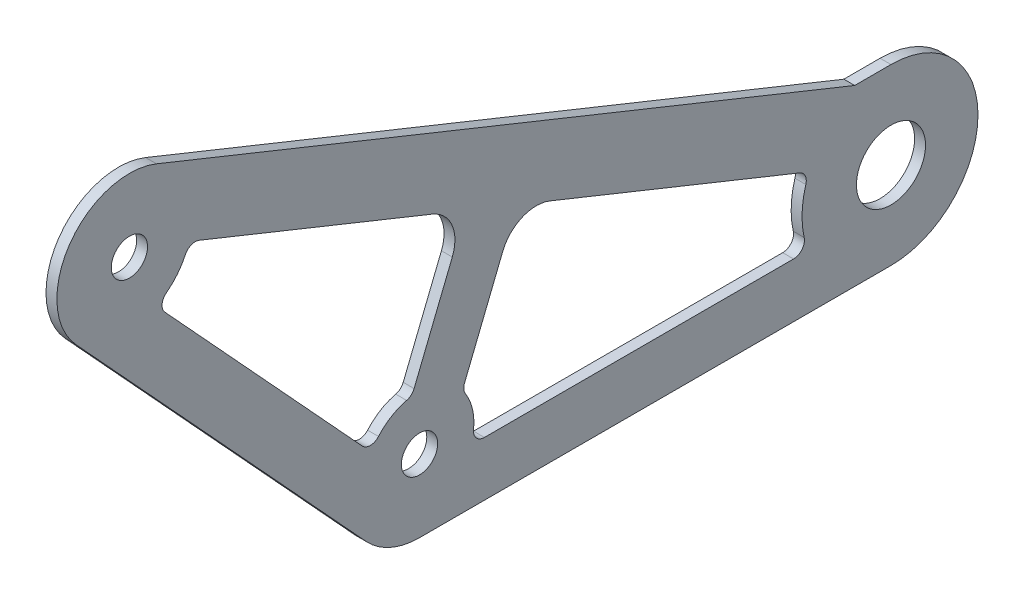
ISO-10303-21;
HEADER;
FILE_DESCRIPTION(('STEP AP214'),'2;1');
FILE_NAME('part.step','',(''),(''),'','','');
FILE_SCHEMA(('AUTOMOTIVE_DESIGN { 1 0 10303 214 1 1 1 1 }'));
ENDSEC;
DATA;
#1=APPLICATION_CONTEXT('core data for automotive mechanical design processes');
#2=APPLICATION_PROTOCOL_DEFINITION('international standard','automotive_design',2000,#1);
#3=PRODUCT_CONTEXT('',#1,'mechanical');
#4=PRODUCT('Part','Part','',(#3));
#5=PRODUCT_RELATED_PRODUCT_CATEGORY('part','',(#4));
#6=PRODUCT_DEFINITION_FORMATION('','',#4);
#7=PRODUCT_DEFINITION_CONTEXT('part definition',#1,'design');
#8=PRODUCT_DEFINITION('design','',#6,#7);
#9=PRODUCT_DEFINITION_SHAPE('','',#8);
#10=(LENGTH_UNIT() NAMED_UNIT(*) SI_UNIT(.MILLI.,.METRE.));
#11=(NAMED_UNIT(*) PLANE_ANGLE_UNIT() SI_UNIT($,.RADIAN.));
#12=(NAMED_UNIT(*) SI_UNIT($,.STERADIAN.) SOLID_ANGLE_UNIT());
#13=UNCERTAINTY_MEASURE_WITH_UNIT(LENGTH_MEASURE(1.E-05),#10,'distance_accuracy_value','');
#14=(GEOMETRIC_REPRESENTATION_CONTEXT(3) GLOBAL_UNCERTAINTY_ASSIGNED_CONTEXT((#13)) GLOBAL_UNIT_ASSIGNED_CONTEXT((#10,
#11,#12)) REPRESENTATION_CONTEXT('',''));
#15=CARTESIAN_POINT('',(0.,0.,0.));
#16=DIRECTION('',(0.,0.,1.));
#17=DIRECTION('',(1.,0.,0.));
#18=AXIS2_PLACEMENT_3D('',#15,#16,#17);
#19=CARTESIAN_POINT('',(3.,20.,65.));
#20=DIRECTION('',(1.,0.,0.));
#21=DIRECTION('',(0.,0.,-1.));
#22=AXIS2_PLACEMENT_3D('',#19,#20,#21);
#23=PLANE('',#22);
#24=CARTESIAN_POINT('',(3.,18.,-38.1369096156083));
#25=DIRECTION('',(1.,0.,0.));
#26=DIRECTION('',(0.,0.,-1.));
#27=AXIS2_PLACEMENT_3D('',#24,#25,#26);
#28=CIRCLE('',#27,3.);
#29=CARTESIAN_POINT('',(3.,15.,-38.1369096156083));
#30=VERTEX_POINT('',#29);
#31=CARTESIAN_POINT('',(3.,18.6539509536785,-41.0647668782123));
#32=VERTEX_POINT('',#31);
#33=EDGE_CURVE('E64',#30,#32,#28,.T.);
#34=ORIENTED_EDGE('',*,*,#33,.F.);
#35=DIRECTION('',(0.,0.,-1.));
#36=VECTOR('',#35,1.);
#37=CARTESIAN_POINT('',(3.,15.,-38.1369096156083));
#38=LINE('',#37,#36);
#39=CARTESIAN_POINT('',(3.,15.,47.1114561800018));
#40=VERTEX_POINT('',#39);
#41=EDGE_CURVE('E296',#40,#30,#38,.T.);
#42=ORIENTED_EDGE('',*,*,#41,.F.);
#43=CARTESIAN_POINT('',(3.,18.,47.1114561800018));
#44=DIRECTION('',(1.,0.,0.));
#45=DIRECTION('',(0.,0.,1.));
#46=AXIS2_PLACEMENT_3D('',#43,#44,#45);
#47=CIRCLE('',#46,3.);
#48=CARTESIAN_POINT('',(3.,18.3333333333333,50.0928801500015));
#49=VERTEX_POINT('',#48);
#50=EDGE_CURVE('E316',#49,#40,#47,.T.);
#51=ORIENTED_EDGE('',*,*,#50,.F.);
#52=CARTESIAN_POINT('',(3.,19.9999999999999,65.0000000000001));
#53=DIRECTION('',(-1.,0.,0.));
#54=DIRECTION('',(0.,0.,-1.));
#55=AXIS2_PLACEMENT_3D('',#52,#53,#54);
#56=CIRCLE('',#55,15.);
#57=CARTESIAN_POINT('',(3.,28.0318087509721,52.3315333134667));
#58=VERTEX_POINT('',#57);
#59=EDGE_CURVE('E319',#58,#49,#56,.T.);
#60=ORIENTED_EDGE('',*,*,#59,.F.);
#61=CARTESIAN_POINT('',(3.,29.6381705011666,49.7978399761601));
#62=DIRECTION('',(1.,0.,0.));
#63=DIRECTION('',(0.,0.,-1.));
#64=AXIS2_PLACEMENT_3D('',#61,#62,#63);
#65=CIRCLE('',#64,3.);
#66=CARTESIAN_POINT('',(3.,30.7590751378482,52.5805675581317));
#67=VERTEX_POINT('',#66);
#68=EDGE_CURVE('E322',#67,#58,#65,.T.);
#69=ORIENTED_EDGE('',*,*,#68,.F.);
#70=DIRECTION('',(0.,-0.927575860657207,0.373634878893876));
#71=VECTOR('',#70,1.);
#72=CARTESIAN_POINT('',(3.,30.7590751378482,52.5805675581317));
#73=LINE('',#72,#71);
#74=CARTESIAN_POINT('',(3.,56.9056929969496,42.0485034848514));
#75=VERTEX_POINT('',#74);
#76=EDGE_CURVE('E325',#75,#67,#73,.T.);
#77=ORIENTED_EDGE('',*,*,#76,.F.);
#78=CARTESIAN_POINT('',(3.,53.1693442080108,32.7727448782793));
#79=DIRECTION('',(1.,0.,0.));
#80=DIRECTION('',(0.,0.,-1.));
#81=AXIS2_PLACEMENT_3D('',#78,#79,#80);
#82=CIRCLE('',#81,10.);
#83=CARTESIAN_POINT('',(3.,62.4451028145829,29.0363960893406));
#84=VERTEX_POINT('',#83);
#85=EDGE_CURVE('E328',#84,#75,#82,.T.);
#86=ORIENTED_EDGE('',*,*,#85,.F.);
#87=DIRECTION('',(0.,0.373634878893876,0.927575860657207));
#88=VECTOR('',#87,1.);
#89=CARTESIAN_POINT('',(3.,34.7300708087196,-39.7681939480967));
#90=LINE('',#89,#88);
#91=CARTESIAN_POINT('',(3.,34.7300708087196,-39.7681939480967));
#92=VERTEX_POINT('',#91);
#93=EDGE_CURVE('E331',#92,#84,#90,.T.);
#94=ORIENTED_EDGE('',*,*,#93,.F.);
#95=CARTESIAN_POINT('',(3.,31.947343226748,-38.647289311415));
#96=DIRECTION('',(1.,0.,0.));
#97=DIRECTION('',(0.,0.,1.));
#98=AXIS2_PLACEMENT_3D('',#95,#96,#97);
#99=CIRCLE('',#98,2.99999999999999);
#100=CARTESIAN_POINT('',(3.,31.081147779691,-41.5195193592172));
#101=VERTEX_POINT('',#100);
#102=EDGE_CURVE('E334',#101,#92,#99,.T.);
#103=ORIENTED_EDGE('',*,*,#102,.F.);
#104=CARTESIAN_POINT('',(3.,24.,-65.));
#105=DIRECTION('',(-1.,0.,0.));
#106=DIRECTION('',(0.,0.,-1.));
#107=AXIS2_PLACEMENT_3D('',#104,#105,#106);
#108=CIRCLE('',#107,24.525);
#109=EDGE_CURVE('E337',#32,#101,#108,.T.);
#110=ORIENTED_EDGE('',*,*,#109,.F.);
#111=EDGE_LOOP('',(#34,#42,#51,#60,#69,#77,#86,#94,#103,#110));
#112=FACE_BOUND('',#111,.T.);
#113=CARTESIAN_POINT('',(3.,20.,65.));
#114=DIRECTION('',(1.,0.,0.));
#115=DIRECTION('',(0.,0.,-1.));
#116=AXIS2_PLACEMENT_3D('',#113,#114,#115);
#117=CIRCLE('',#116,4.99999999999999);
#118=CARTESIAN_POINT('',(3.,20.,60.));
#119=VERTEX_POINT('',#118);
#120=EDGE_CURVE('E236',#119,#119,#117,.T.);
#121=ORIENTED_EDGE('',*,*,#120,.F.);
#122=EDGE_LOOP('',(#121));
#123=FACE_BOUND('',#122,.T.);
#124=CARTESIAN_POINT('',(3.,107.,145.));
#125=DIRECTION('',(1.,0.,0.));
#126=DIRECTION('',(0.,0.,-1.));
#127=AXIS2_PLACEMENT_3D('',#124,#125,#126);
#128=CIRCLE('',#127,5.);
#129=CARTESIAN_POINT('',(3.,107.,140.));
#130=VERTEX_POINT('',#129);
#131=EDGE_CURVE('E373',#130,#130,#128,.T.);
#132=ORIENTED_EDGE('',*,*,#131,.F.);
#133=EDGE_LOOP('',(#132));
#134=FACE_BOUND('',#133,.T.);
#135=CARTESIAN_POINT('',(3.,24.,-65.));
#136=DIRECTION('',(1.,0.,0.));
#137=DIRECTION('',(0.,0.,-1.));
#138=AXIS2_PLACEMENT_3D('',#135,#136,#137);
#139=CIRCLE('',#138,9.52499999999998);
#140=CARTESIAN_POINT('',(3.,24.,-74.525));
#141=VERTEX_POINT('',#140);
#142=EDGE_CURVE('E379',#141,#141,#139,.T.);
#143=ORIENTED_EDGE('',*,*,#142,.F.);
#144=EDGE_LOOP('',(#143));
#145=FACE_BOUND('',#144,.T.);
#146=CARTESIAN_POINT('',(3.,20.,65.));
#147=DIRECTION('',(1.,0.,0.));
#148=DIRECTION('',(0.,0.,-1.));
#149=AXIS2_PLACEMENT_3D('',#146,#147,#148);
#150=CIRCLE('',#149,20.);
#151=CARTESIAN_POINT('',(3.,6.46253571137716,79.7219924138773));
#152=VERTEX_POINT('',#151);
#153=CARTESIAN_POINT('',(3.,0.,65.));
#154=VERTEX_POINT('',#153);
#155=EDGE_CURVE('E386',#152,#154,#150,.T.);
#156=ORIENTED_EDGE('',*,*,#155,.T.);
#157=DIRECTION('',(0.,0.,-1.));
#158=VECTOR('',#157,1.);
#159=CARTESIAN_POINT('',(3.,0.,65.));
#160=LINE('',#159,#158);
#161=CARTESIAN_POINT('',(3.,0.,-65.));
#162=VERTEX_POINT('',#161);
#163=EDGE_CURVE('E389',#154,#162,#160,.T.);
#164=ORIENTED_EDGE('',*,*,#163,.T.);
#165=CARTESIAN_POINT('',(3.,24.,-65.));
#166=DIRECTION('',(1.,0.,0.));
#167=DIRECTION('',(0.,0.,-1.));
#168=AXIS2_PLACEMENT_3D('',#165,#166,#167);
#169=CIRCLE('',#168,24.);
#170=CARTESIAN_POINT('',(3.,48.,-65.));
#171=VERTEX_POINT('',#170);
#172=EDGE_CURVE('E392',#162,#171,#169,.T.);
#173=ORIENTED_EDGE('',*,*,#172,.T.);
#174=DIRECTION('',(0.,0.,1.));
#175=VECTOR('',#174,1.);
#176=CARTESIAN_POINT('',(3.,48.,-65.));
#177=LINE('',#176,#175);
#178=CARTESIAN_POINT('',(3.,48.,-55.));
#179=VERTEX_POINT('',#178);
#180=EDGE_CURVE('E394',#171,#179,#177,.T.);
#181=ORIENTED_EDGE('',*,*,#180,.T.);
#182=DIRECTION('',(0.,0.373634878893876,0.927575860657207));
#183=VECTOR('',#182,1.);
#184=CARTESIAN_POINT('',(3.,125.551517213144,137.527302422122));
#185=LINE('',#184,#183);
#186=CARTESIAN_POINT('',(3.,125.551517213144,137.527302422122));
#187=VERTEX_POINT('',#186);
#188=EDGE_CURVE('E396',#179,#187,#185,.T.);
#189=ORIENTED_EDGE('',*,*,#188,.T.);
#190=CARTESIAN_POINT('',(3.,107.,145.));
#191=DIRECTION('',(1.,0.,0.));
#192=DIRECTION('',(0.,0.,-1.));
#193=AXIS2_PLACEMENT_3D('',#190,#191,#192);
#194=CIRCLE('',#193,20.);
#195=CARTESIAN_POINT('',(3.,93.4625357113772,159.721992413877));
#196=VERTEX_POINT('',#195);
#197=EDGE_CURVE('E398',#187,#196,#194,.T.);
#198=ORIENTED_EDGE('',*,*,#197,.T.);
#199=DIRECTION('',(0.,-0.736099620693866,-0.676873214431142));
#200=VECTOR('',#199,1.);
#201=CARTESIAN_POINT('',(3.,93.4625357113771,159.721992413877));
#202=LINE('',#201,#200);
#203=EDGE_CURVE('E400',#196,#152,#202,.T.);
#204=ORIENTED_EDGE('',*,*,#203,.T.);
#205=EDGE_LOOP('',(#156,#164,#173,#181,#189,#198,#204));
#206=FACE_BOUND('',#205,.T.);
#207=CARTESIAN_POINT('',(3.,90.9980560701508,133.002592343929));
#208=DIRECTION('',(1.,0.,0.));
#209=DIRECTION('',(0.,0.,1.));
#210=AXIS2_PLACEMENT_3D('',#207,#208,#209);
#211=CIRCLE('',#210,2.99999999999999);
#212=CARTESIAN_POINT('',(3.,93.3983476596282,134.802203492339));
#213=VERTEX_POINT('',#212);
#214=CARTESIAN_POINT('',(3.,88.9674364268574,135.21089120601));
#215=VERTEX_POINT('',#214);
#216=EDGE_CURVE('E56',#213,#215,#211,.T.);
#217=ORIENTED_EDGE('',*,*,#216,.F.);
#218=CARTESIAN_POINT('',(3.,107.,145.));
#219=DIRECTION('',(-1.,0.,0.));
#220=DIRECTION('',(0.,0.,-1.));
#221=AXIS2_PLACEMENT_3D('',#218,#219,#220);
#222=CIRCLE('',#221,17.);
#223=CARTESIAN_POINT('',(3.,99.8677122869729,129.568523337716));
#224=VERTEX_POINT('',#223);
#225=EDGE_CURVE('E228',#224,#213,#222,.T.);
#226=ORIENTED_EDGE('',*,*,#225,.F.);
#227=CARTESIAN_POINT('',(3.,98.6090732787916,126.845321573784));
#228=DIRECTION('',(1.,0.,0.));
#229=DIRECTION('',(0.,0.,-1.));
#230=AXIS2_PLACEMENT_3D('',#227,#228,#229);
#231=CIRCLE('',#230,3.);
#232=CARTESIAN_POINT('',(3.,101.391800860763,125.724416937102));
#233=VERTEX_POINT('',#232);
#234=EDGE_CURVE('E269',#233,#224,#231,.T.);
#235=ORIENTED_EDGE('',*,*,#234,.F.);
#236=DIRECTION('',(0.,0.373634878893876,0.927575860657207));
#237=VECTOR('',#236,1.);
#238=CARTESIAN_POINT('',(3.,101.391800860763,125.724416937102));
#239=LINE('',#238,#237);
#240=CARTESIAN_POINT('',(3.,75.5223235758686,61.5015512123428));
#241=VERTEX_POINT('',#240);
#242=EDGE_CURVE('E266',#241,#233,#239,.T.);
#243=ORIENTED_EDGE('',*,*,#242,.F.);
#244=CARTESIAN_POINT('',(3.,66.2465649692965,65.2379000012816));
#245=DIRECTION('',(1.,0.,0.));
#246=DIRECTION('',(0.,0.,1.));
#247=AXIS2_PLACEMENT_3D('',#244,#245,#246);
#248=CIRCLE('',#247,9.99999999999999);
#249=CARTESIAN_POINT('',(3.,62.5102161803577,55.9621413947095));
#250=VERTEX_POINT('',#249);
#251=EDGE_CURVE('E263',#250,#241,#248,.T.);
#252=ORIENTED_EDGE('',*,*,#251,.F.);
#253=DIRECTION('',(0.,0.927575860657208,-0.373634878893875));
#254=VECTOR('',#253,1.);
#255=CARTESIAN_POINT('',(3.,36.3635983212564,66.4942054679898));
#256=LINE('',#255,#254);
#257=CARTESIAN_POINT('',(3.,36.3635983212564,66.4942054679898));
#258=VERTEX_POINT('',#257);
#259=EDGE_CURVE('E260',#258,#250,#256,.T.);
#260=ORIENTED_EDGE('',*,*,#259,.F.);
#261=CARTESIAN_POINT('',(3.,37.4845029579381,69.2769330499614));
#262=DIRECTION('',(1.,0.,0.));
#263=DIRECTION('',(0.,0.,1.));
#264=AXIS2_PLACEMENT_3D('',#261,#262,#263);
#265=CIRCLE('',#264,3.);
#266=CARTESIAN_POINT('',(3.,34.570419131615,68.5641108749678));
#267=VERTEX_POINT('',#266);
#268=EDGE_CURVE('E257',#267,#258,#265,.T.);
#269=ORIENTED_EDGE('',*,*,#268,.F.);
#270=CARTESIAN_POINT('',(3.,19.9999999999999,65.0000000000001));
#271=DIRECTION('',(-1.,0.,0.));
#272=DIRECTION('',(0.,0.,-1.));
#273=AXIS2_PLACEMENT_3D('',#270,#271,#272);
#274=CIRCLE('',#273,15.);
#275=CARTESIAN_POINT('',(3.,29.84500324317,76.3170628319353));
#276=VERTEX_POINT('',#275);
#277=EDGE_CURVE('E254',#276,#267,#274,.T.);
#278=ORIENTED_EDGE('',*,*,#277,.F.);
#279=CARTESIAN_POINT('',(3.,31.8140038918041,78.5804753983223));
#280=DIRECTION('',(1.,0.,0.));
#281=DIRECTION('',(0.,0.,-1.));
#282=AXIS2_PLACEMENT_3D('',#279,#280,#281);
#283=CIRCLE('',#282,3.);
#284=CARTESIAN_POINT('',(3.,29.7833842485106,80.7887742604039));
#285=VERTEX_POINT('',#284);
#286=EDGE_CURVE('E251',#285,#276,#283,.T.);
#287=ORIENTED_EDGE('',*,*,#286,.F.);
#288=DIRECTION('',(0.,-0.736099620693866,-0.676873214431141));
#289=VECTOR('',#288,1.);
#290=CARTESIAN_POINT('',(3.,88.9674364268574,135.21089120601));
#291=LINE('',#290,#289);
#292=EDGE_CURVE('E244',#215,#285,#291,.T.);
#293=ORIENTED_EDGE('',*,*,#292,.F.);
#294=EDGE_LOOP('',(#217,#226,#235,#243,#252,#260,#269,#278,#287,#293));
#295=FACE_BOUND('',#294,.T.);
#296=ADVANCED_FACE('F41',(#112,#123,#134,#145,#206,#295),#23,.T.);
#297=CARTESIAN_POINT('',(0.,20.,65.));
#298=DIRECTION('',(1.,0.,0.));
#299=DIRECTION('',(0.,0.,-1.));
#300=AXIS2_PLACEMENT_3D('',#297,#298,#299);
#301=PLANE('',#300);
#302=CARTESIAN_POINT('',(0.,20.,65.));
#303=DIRECTION('',(1.,0.,0.));
#304=DIRECTION('',(0.,0.,-1.));
#305=AXIS2_PLACEMENT_3D('',#302,#303,#304);
#306=CIRCLE('',#305,4.99999999999999);
#307=CARTESIAN_POINT('',(0.,20.,60.));
#308=VERTEX_POINT('',#307);
#309=EDGE_CURVE('E370',#308,#308,#306,.T.);
#310=ORIENTED_EDGE('',*,*,#309,.T.);
#311=EDGE_LOOP('',(#310));
#312=FACE_BOUND('',#311,.T.);
#313=CARTESIAN_POINT('',(0.,107.,145.));
#314=DIRECTION('',(1.,0.,0.));
#315=DIRECTION('',(0.,0.,-1.));
#316=AXIS2_PLACEMENT_3D('',#313,#314,#315);
#317=CIRCLE('',#316,5.);
#318=CARTESIAN_POINT('',(0.,107.,140.));
#319=VERTEX_POINT('',#318);
#320=EDGE_CURVE('E376',#319,#319,#317,.T.);
#321=ORIENTED_EDGE('',*,*,#320,.T.);
#322=EDGE_LOOP('',(#321));
#323=FACE_BOUND('',#322,.T.);
#324=CARTESIAN_POINT('',(0.,24.,-65.));
#325=DIRECTION('',(1.,0.,0.));
#326=DIRECTION('',(0.,0.,-1.));
#327=AXIS2_PLACEMENT_3D('',#324,#325,#326);
#328=CIRCLE('',#327,9.52499999999999);
#329=CARTESIAN_POINT('',(0.,24.,-74.525));
#330=VERTEX_POINT('',#329);
#331=EDGE_CURVE('E382',#330,#330,#328,.T.);
#332=ORIENTED_EDGE('',*,*,#331,.T.);
#333=EDGE_LOOP('',(#332));
#334=FACE_BOUND('',#333,.T.);
#335=CARTESIAN_POINT('',(0.,20.,65.));
#336=DIRECTION('',(1.,0.,0.));
#337=DIRECTION('',(0.,0.,-1.));
#338=AXIS2_PLACEMENT_3D('',#335,#336,#337);
#339=CIRCLE('',#338,20.);
#340=CARTESIAN_POINT('',(0.,6.46253571137716,79.7219924138773));
#341=VERTEX_POINT('',#340);
#342=CARTESIAN_POINT('',(0.,0.,65.));
#343=VERTEX_POINT('',#342);
#344=EDGE_CURVE('E385',#341,#343,#339,.T.);
#345=ORIENTED_EDGE('',*,*,#344,.F.);
#346=DIRECTION('',(0.,-0.736099620693866,-0.676873214431142));
#347=VECTOR('',#346,1.);
#348=CARTESIAN_POINT('',(0.,93.4625357113771,159.721992413877));
#349=LINE('',#348,#347);
#350=CARTESIAN_POINT('',(0.,93.4625357113772,159.721992413877));
#351=VERTEX_POINT('',#350);
#352=EDGE_CURVE('E390',#351,#341,#349,.T.);
#353=ORIENTED_EDGE('',*,*,#352,.F.);
#354=CARTESIAN_POINT('',(0.,107.,145.));
#355=DIRECTION('',(1.,0.,0.));
#356=DIRECTION('',(0.,0.,-1.));
#357=AXIS2_PLACEMENT_3D('',#354,#355,#356);
#358=CIRCLE('',#357,20.);
#359=CARTESIAN_POINT('',(0.,125.551517213144,137.527302422122));
#360=VERTEX_POINT('',#359);
#361=EDGE_CURVE('E413',#360,#351,#358,.T.);
#362=ORIENTED_EDGE('',*,*,#361,.F.);
#363=DIRECTION('',(0.,0.373634878893876,0.927575860657207));
#364=VECTOR('',#363,1.);
#365=CARTESIAN_POINT('',(0.,125.551517213144,137.527302422122));
#366=LINE('',#365,#364);
#367=CARTESIAN_POINT('',(0.,48.,-55.));
#368=VERTEX_POINT('',#367);
#369=EDGE_CURVE('E411',#368,#360,#366,.T.);
#370=ORIENTED_EDGE('',*,*,#369,.F.);
#371=DIRECTION('',(0.,0.,1.));
#372=VECTOR('',#371,1.);
#373=CARTESIAN_POINT('',(0.,48.,-65.));
#374=LINE('',#373,#372);
#375=CARTESIAN_POINT('',(0.,48.,-65.));
#376=VERTEX_POINT('',#375);
#377=EDGE_CURVE('E409',#376,#368,#374,.T.);
#378=ORIENTED_EDGE('',*,*,#377,.F.);
#379=CARTESIAN_POINT('',(0.,24.,-65.));
#380=DIRECTION('',(1.,0.,0.));
#381=DIRECTION('',(0.,0.,-1.));
#382=AXIS2_PLACEMENT_3D('',#379,#380,#381);
#383=CIRCLE('',#382,24.);
#384=CARTESIAN_POINT('',(0.,0.,-65.));
#385=VERTEX_POINT('',#384);
#386=EDGE_CURVE('E407',#385,#376,#383,.T.);
#387=ORIENTED_EDGE('',*,*,#386,.F.);
#388=DIRECTION('',(0.,0.,-1.));
#389=VECTOR('',#388,1.);
#390=CARTESIAN_POINT('',(0.,0.,65.));
#391=LINE('',#390,#389);
#392=EDGE_CURVE('E405',#343,#385,#391,.T.);
#393=ORIENTED_EDGE('',*,*,#392,.F.);
#394=EDGE_LOOP('',(#345,#353,#362,#370,#378,#387,#393));
#395=FACE_BOUND('',#394,.T.);
#396=DIRECTION('',(0.,0.,1.));
#397=VECTOR('',#396,1.);
#398=CARTESIAN_POINT('',(0.,15.,-38.1369096156083));
#399=LINE('',#398,#397);
#400=CARTESIAN_POINT('',(0.,15.,-38.1369096156083));
#401=VERTEX_POINT('',#400);
#402=CARTESIAN_POINT('',(0.,15.,47.1114561800018));
#403=VERTEX_POINT('',#402);
#404=EDGE_CURVE('E344',#401,#403,#399,.T.);
#405=ORIENTED_EDGE('',*,*,#404,.F.);
#406=CARTESIAN_POINT('',(0.,18.,-38.1369096156083));
#407=DIRECTION('',(1.,0.,0.));
#408=DIRECTION('',(0.,0.,-1.));
#409=AXIS2_PLACEMENT_3D('',#406,#407,#408);
#410=CIRCLE('',#409,3.);
#411=CARTESIAN_POINT('',(0.,18.6539509536785,-41.0647668782123));
#412=VERTEX_POINT('',#411);
#413=EDGE_CURVE('E341',#412,#401,#410,.F.);
#414=ORIENTED_EDGE('',*,*,#413,.F.);
#415=CARTESIAN_POINT('',(0.,24.,-65.));
#416=DIRECTION('',(1.,0.,0.));
#417=DIRECTION('',(0.,0.,-1.));
#418=AXIS2_PLACEMENT_3D('',#415,#416,#417);
#419=CIRCLE('',#418,24.525);
#420=CARTESIAN_POINT('',(0.,31.081147779691,-41.5195193592172));
#421=VERTEX_POINT('',#420);
#422=EDGE_CURVE('E290',#421,#412,#419,.T.);
#423=ORIENTED_EDGE('',*,*,#422,.F.);
#424=CARTESIAN_POINT('',(0.,31.947343226748,-38.647289311415));
#425=DIRECTION('',(1.,0.,0.));
#426=DIRECTION('',(0.,0.,-1.));
#427=AXIS2_PLACEMENT_3D('',#424,#425,#426);
#428=CIRCLE('',#427,2.99999999999999);
#429=CARTESIAN_POINT('',(0.,34.7300708087196,-39.7681939480967));
#430=VERTEX_POINT('',#429);
#431=EDGE_CURVE('E365',#430,#421,#428,.F.);
#432=ORIENTED_EDGE('',*,*,#431,.F.);
#433=DIRECTION('',(0.,-0.373634878893876,-0.927575860657207));
#434=VECTOR('',#433,1.);
#435=CARTESIAN_POINT('',(0.,34.7300708087196,-39.7681939480967));
#436=LINE('',#435,#434);
#437=CARTESIAN_POINT('',(0.,62.4451028145829,29.0363960893406));
#438=VERTEX_POINT('',#437);
#439=EDGE_CURVE('E362',#438,#430,#436,.T.);
#440=ORIENTED_EDGE('',*,*,#439,.F.);
#441=CARTESIAN_POINT('',(0.,53.1693442080108,32.7727448782793));
#442=DIRECTION('',(1.,0.,0.));
#443=DIRECTION('',(0.,0.,-1.));
#444=AXIS2_PLACEMENT_3D('',#441,#442,#443);
#445=CIRCLE('',#444,10.);
#446=CARTESIAN_POINT('',(0.,56.9056929969496,42.0485034848514));
#447=VERTEX_POINT('',#446);
#448=EDGE_CURVE('E359',#447,#438,#445,.F.);
#449=ORIENTED_EDGE('',*,*,#448,.F.);
#450=DIRECTION('',(0.,0.927575860657207,-0.373634878893876));
#451=VECTOR('',#450,1.);
#452=CARTESIAN_POINT('',(0.,30.7590751378482,52.5805675581317));
#453=LINE('',#452,#451);
#454=CARTESIAN_POINT('',(0.,30.7590751378482,52.5805675581317));
#455=VERTEX_POINT('',#454);
#456=EDGE_CURVE('E356',#455,#447,#453,.T.);
#457=ORIENTED_EDGE('',*,*,#456,.F.);
#458=CARTESIAN_POINT('',(0.,29.6381705011666,49.7978399761601));
#459=DIRECTION('',(1.,0.,0.));
#460=DIRECTION('',(0.,0.,-1.));
#461=AXIS2_PLACEMENT_3D('',#458,#459,#460);
#462=CIRCLE('',#461,3.);
#463=CARTESIAN_POINT('',(0.,28.0318087509721,52.3315333134667));
#464=VERTEX_POINT('',#463);
#465=EDGE_CURVE('E353',#464,#455,#462,.F.);
#466=ORIENTED_EDGE('',*,*,#465,.F.);
#467=CARTESIAN_POINT('',(0.,19.9999999999999,65.0000000000001));
#468=DIRECTION('',(1.,0.,0.));
#469=DIRECTION('',(0.,0.,-1.));
#470=AXIS2_PLACEMENT_3D('',#467,#468,#469);
#471=CIRCLE('',#470,15.);
#472=CARTESIAN_POINT('',(0.,18.3333333333333,50.0928801500015));
#473=VERTEX_POINT('',#472);
#474=EDGE_CURVE('E350',#473,#464,#471,.T.);
#475=ORIENTED_EDGE('',*,*,#474,.F.);
#476=CARTESIAN_POINT('',(0.,18.,47.1114561800018));
#477=DIRECTION('',(1.,0.,0.));
#478=DIRECTION('',(0.,0.,-1.));
#479=AXIS2_PLACEMENT_3D('',#476,#477,#478);
#480=CIRCLE('',#479,3.);
#481=EDGE_CURVE('E347',#403,#473,#480,.F.);
#482=ORIENTED_EDGE('',*,*,#481,.F.);
#483=EDGE_LOOP('',(#405,#414,#423,#432,#440,#449,#457,#466,#475,#482));
#484=FACE_BOUND('',#483,.T.);
#485=CARTESIAN_POINT('',(0.,107.,145.));
#486=DIRECTION('',(1.,0.,0.));
#487=DIRECTION('',(0.,0.,-1.));
#488=AXIS2_PLACEMENT_3D('',#485,#486,#487);
#489=CIRCLE('',#488,17.);
#490=CARTESIAN_POINT('',(0.,93.3983476596282,134.802203492339));
#491=VERTEX_POINT('',#490);
#492=CARTESIAN_POINT('',(0.,99.8677122869729,129.568523337716));
#493=VERTEX_POINT('',#492);
#494=EDGE_CURVE('E242',#491,#493,#489,.T.);
#495=ORIENTED_EDGE('',*,*,#494,.F.);
#496=CARTESIAN_POINT('',(0.,90.9980560701508,133.002592343929));
#497=DIRECTION('',(1.,0.,0.));
#498=DIRECTION('',(0.,0.,-1.));
#499=AXIS2_PLACEMENT_3D('',#496,#497,#498);
#500=CIRCLE('',#499,2.99999999999999);
#501=CARTESIAN_POINT('',(0.,88.9674364268574,135.21089120601));
#502=VERTEX_POINT('',#501);
#503=EDGE_CURVE('E222',#502,#491,#500,.F.);
#504=ORIENTED_EDGE('',*,*,#503,.F.);
#505=DIRECTION('',(0.,0.736099620693866,0.676873214431141));
#506=VECTOR('',#505,1.);
#507=CARTESIAN_POINT('',(0.,88.9674364268574,135.21089120601));
#508=LINE('',#507,#506);
#509=CARTESIAN_POINT('',(0.,29.7833842485106,80.7887742604039));
#510=VERTEX_POINT('',#509);
#511=EDGE_CURVE('E232',#510,#502,#508,.T.);
#512=ORIENTED_EDGE('',*,*,#511,.F.);
#513=CARTESIAN_POINT('',(0.,31.8140038918041,78.5804753983223));
#514=DIRECTION('',(1.,0.,0.));
#515=DIRECTION('',(0.,0.,-1.));
#516=AXIS2_PLACEMENT_3D('',#513,#514,#515);
#517=CIRCLE('',#516,3.);
#518=CARTESIAN_POINT('',(0.,29.84500324317,76.3170628319353));
#519=VERTEX_POINT('',#518);
#520=EDGE_CURVE('E367',#519,#510,#517,.F.);
#521=ORIENTED_EDGE('',*,*,#520,.F.);
#522=CARTESIAN_POINT('',(0.,19.9999999999999,65.0000000000001));
#523=DIRECTION('',(1.,0.,0.));
#524=DIRECTION('',(0.,0.,-1.));
#525=AXIS2_PLACEMENT_3D('',#522,#523,#524);
#526=CIRCLE('',#525,15.);
#527=CARTESIAN_POINT('',(0.,34.570419131615,68.5641108749678));
#528=VERTEX_POINT('',#527);
#529=EDGE_CURVE('E588',#528,#519,#526,.T.);
#530=ORIENTED_EDGE('',*,*,#529,.F.);
#531=CARTESIAN_POINT('',(0.,37.4845029579381,69.2769330499614));
#532=DIRECTION('',(1.,0.,0.));
#533=DIRECTION('',(0.,0.,-1.));
#534=AXIS2_PLACEMENT_3D('',#531,#532,#533);
#535=CIRCLE('',#534,3.);
#536=CARTESIAN_POINT('',(0.,36.3635983212564,66.4942054679898));
#537=VERTEX_POINT('',#536);
#538=EDGE_CURVE('E585',#537,#528,#535,.F.);
#539=ORIENTED_EDGE('',*,*,#538,.F.);
#540=DIRECTION('',(0.,-0.927575860657208,0.373634878893875));
#541=VECTOR('',#540,1.);
#542=CARTESIAN_POINT('',(0.,36.3635983212564,66.4942054679898));
#543=LINE('',#542,#541);
#544=CARTESIAN_POINT('',(0.,62.5102161803577,55.9621413947095));
#545=VERTEX_POINT('',#544);
#546=EDGE_CURVE('E582',#545,#537,#543,.T.);
#547=ORIENTED_EDGE('',*,*,#546,.F.);
#548=CARTESIAN_POINT('',(0.,66.2465649692965,65.2379000012816));
#549=DIRECTION('',(1.,0.,0.));
#550=DIRECTION('',(0.,0.,-1.));
#551=AXIS2_PLACEMENT_3D('',#548,#549,#550);
#552=CIRCLE('',#551,9.99999999999999);
#553=CARTESIAN_POINT('',(0.,75.5223235758686,61.5015512123428));
#554=VERTEX_POINT('',#553);
#555=EDGE_CURVE('E577',#554,#545,#552,.F.);
#556=ORIENTED_EDGE('',*,*,#555,.F.);
#557=DIRECTION('',(0.,-0.373634878893876,-0.927575860657207));
#558=VECTOR('',#557,1.);
#559=CARTESIAN_POINT('',(0.,101.391800860763,125.724416937102));
#560=LINE('',#559,#558);
#561=CARTESIAN_POINT('',(0.,101.391800860763,125.724416937102));
#562=VERTEX_POINT('',#561);
#563=EDGE_CURVE('E576',#562,#554,#560,.T.);
#564=ORIENTED_EDGE('',*,*,#563,.F.);
#565=CARTESIAN_POINT('',(0.,98.6090732787916,126.845321573784));
#566=DIRECTION('',(1.,0.,0.));
#567=DIRECTION('',(0.,0.,-1.));
#568=AXIS2_PLACEMENT_3D('',#565,#566,#567);
#569=CIRCLE('',#568,3.);
#570=EDGE_CURVE('E246',#493,#562,#569,.F.);
#571=ORIENTED_EDGE('',*,*,#570,.F.);
#572=EDGE_LOOP('',(#495,#504,#512,#521,#530,#539,#547,#556,#564,#571));
#573=FACE_BOUND('',#572,.T.);
#574=ADVANCED_FACE('F239',(#312,#323,#334,#395,#484,#573),#301,.F.);
#575=CARTESIAN_POINT('',(3.,20.,65.));
#576=DIRECTION('',(-1.,0.,0.));
#577=DIRECTION('',(0.,0.,1.));
#578=AXIS2_PLACEMENT_3D('',#575,#576,#577);
#579=CYLINDRICAL_SURFACE('',#578,20.);
#580=ORIENTED_EDGE('',*,*,#344,.T.);
#581=DIRECTION('',(-1.,0.,0.));
#582=VECTOR('',#581,1.);
#583=CARTESIAN_POINT('',(3.,0.,65.));
#584=LINE('',#583,#582);
#585=EDGE_CURVE('E11',#154,#343,#584,.T.);
#586=ORIENTED_EDGE('',*,*,#585,.F.);
#587=ORIENTED_EDGE('',*,*,#155,.F.);
#588=DIRECTION('',(-1.,0.,0.));
#589=VECTOR('',#588,1.);
#590=CARTESIAN_POINT('',(3.,6.46253571137716,79.7219924138773));
#591=LINE('',#590,#589);
#592=EDGE_CURVE('E402',#152,#341,#591,.T.);
#593=ORIENTED_EDGE('',*,*,#592,.T.);
#594=EDGE_LOOP('',(#580,#586,#587,#593));
#595=FACE_BOUND('',#594,.T.);
#596=ADVANCED_FACE('F43',(#595),#579,.T.);
#597=CARTESIAN_POINT('',(3.,0.,65.));
#598=DIRECTION('',(0.,1.,0.));
#599=DIRECTION('',(0.,0.,1.));
#600=AXIS2_PLACEMENT_3D('',#597,#598,#599);
#601=PLANE('',#600);
#602=ORIENTED_EDGE('',*,*,#392,.T.);
#603=DIRECTION('',(-1.,0.,0.));
#604=VECTOR('',#603,1.);
#605=CARTESIAN_POINT('',(3.,0.,-65.));
#606=LINE('',#605,#604);
#607=EDGE_CURVE('E49',#162,#385,#606,.T.);
#608=ORIENTED_EDGE('',*,*,#607,.F.);
#609=ORIENTED_EDGE('',*,*,#163,.F.);
#610=ORIENTED_EDGE('',*,*,#585,.T.);
#611=EDGE_LOOP('',(#602,#608,#609,#610));
#612=FACE_BOUND('',#611,.T.);
#613=ADVANCED_FACE('F457',(#612),#601,.F.);
#614=CARTESIAN_POINT('',(3.,24.,-65.));
#615=DIRECTION('',(-1.,0.,0.));
#616=DIRECTION('',(0.,0.,1.));
#617=AXIS2_PLACEMENT_3D('',#614,#615,#616);
#618=CYLINDRICAL_SURFACE('',#617,24.);
#619=ORIENTED_EDGE('',*,*,#386,.T.);
#620=DIRECTION('',(-1.,0.,0.));
#621=VECTOR('',#620,1.);
#622=CARTESIAN_POINT('',(3.,48.,-65.));
#623=LINE('',#622,#621);
#624=EDGE_CURVE('E427',#171,#376,#623,.T.);
#625=ORIENTED_EDGE('',*,*,#624,.F.);
#626=ORIENTED_EDGE('',*,*,#172,.F.);
#627=ORIENTED_EDGE('',*,*,#607,.T.);
#628=EDGE_LOOP('',(#619,#625,#626,#627));
#629=FACE_BOUND('',#628,.T.);
#630=ADVANCED_FACE('F434',(#629),#618,.T.);
#631=CARTESIAN_POINT('',(3.,48.,-65.));
#632=DIRECTION('',(0.,-1.,0.));
#633=DIRECTION('',(0.,0.,-1.));
#634=AXIS2_PLACEMENT_3D('',#631,#632,#633);
#635=PLANE('',#634);
#636=ORIENTED_EDGE('',*,*,#377,.T.);
#637=DIRECTION('',(-1.,0.,0.));
#638=VECTOR('',#637,1.);
#639=CARTESIAN_POINT('',(3.,48.,-55.));
#640=LINE('',#639,#638);
#641=EDGE_CURVE('E424',#179,#368,#640,.T.);
#642=ORIENTED_EDGE('',*,*,#641,.F.);
#643=ORIENTED_EDGE('',*,*,#180,.F.);
#644=ORIENTED_EDGE('',*,*,#624,.T.);
#645=EDGE_LOOP('',(#636,#642,#643,#644));
#646=FACE_BOUND('',#645,.T.);
#647=ADVANCED_FACE('F445',(#646),#635,.F.);
#648=CARTESIAN_POINT('',(3.,125.551517213144,137.527302422122));
#649=DIRECTION('',(0.,-0.927575860657207,0.373634878893876));
#650=DIRECTION('',(0.,-0.373634878893876,-0.927575860657207));
#651=AXIS2_PLACEMENT_3D('',#648,#649,#650);
#652=PLANE('',#651);
#653=ORIENTED_EDGE('',*,*,#369,.T.);
#654=DIRECTION('',(-1.,0.,0.));
#655=VECTOR('',#654,1.);
#656=CARTESIAN_POINT('',(3.,125.551517213144,137.527302422122));
#657=LINE('',#656,#655);
#658=EDGE_CURVE('E421',#187,#360,#657,.T.);
#659=ORIENTED_EDGE('',*,*,#658,.F.);
#660=ORIENTED_EDGE('',*,*,#188,.F.);
#661=ORIENTED_EDGE('',*,*,#641,.T.);
#662=EDGE_LOOP('',(#653,#659,#660,#661));
#663=FACE_BOUND('',#662,.T.);
#664=ADVANCED_FACE('F449',(#663),#652,.F.);
#665=CARTESIAN_POINT('',(3.,107.,145.));
#666=DIRECTION('',(-1.,0.,0.));
#667=DIRECTION('',(0.,0.,1.));
#668=AXIS2_PLACEMENT_3D('',#665,#666,#667);
#669=CYLINDRICAL_SURFACE('',#668,20.);
#670=ORIENTED_EDGE('',*,*,#361,.T.);
#671=DIRECTION('',(-1.,0.,0.));
#672=VECTOR('',#671,1.);
#673=CARTESIAN_POINT('',(3.,93.4625357113772,159.721992413877));
#674=LINE('',#673,#672);
#675=EDGE_CURVE('E418',#196,#351,#674,.T.);
#676=ORIENTED_EDGE('',*,*,#675,.F.);
#677=ORIENTED_EDGE('',*,*,#197,.F.);
#678=ORIENTED_EDGE('',*,*,#658,.T.);
#679=EDGE_LOOP('',(#670,#676,#677,#678));
#680=FACE_BOUND('',#679,.T.);
#681=ADVANCED_FACE('F465',(#680),#669,.T.);
#682=CARTESIAN_POINT('',(3.,93.4625357113771,159.721992413877));
#683=DIRECTION('',(0.,0.676873214431142,-0.736099620693866));
#684=DIRECTION('',(0.,0.736099620693866,0.676873214431142));
#685=AXIS2_PLACEMENT_3D('',#682,#683,#684);
#686=PLANE('',#685);
#687=ORIENTED_EDGE('',*,*,#352,.T.);
#688=ORIENTED_EDGE('',*,*,#592,.F.);
#689=ORIENTED_EDGE('',*,*,#203,.F.);
#690=ORIENTED_EDGE('',*,*,#675,.T.);
#691=EDGE_LOOP('',(#687,#688,#689,#690));
#692=FACE_BOUND('',#691,.T.);
#693=ADVANCED_FACE('F462',(#692),#686,.F.);
#694=CARTESIAN_POINT('',(3.,24.,-65.));
#695=DIRECTION('',(1.,0.,0.));
#696=DIRECTION('',(0.,0.,-1.));
#697=AXIS2_PLACEMENT_3D('',#694,#695,#696);
#698=CYLINDRICAL_SURFACE('',#697,9.52499999999999);
#699=ORIENTED_EDGE('',*,*,#331,.F.);
#700=EDGE_LOOP('',(#699));
#701=FACE_BOUND('',#700,.T.);
#702=ORIENTED_EDGE('',*,*,#142,.T.);
#703=EDGE_LOOP('',(#702));
#704=FACE_BOUND('',#703,.T.);
#705=ADVANCED_FACE('F472',(#701,#704),#698,.F.);
#706=CARTESIAN_POINT('',(3.,107.,145.));
#707=DIRECTION('',(1.,0.,0.));
#708=DIRECTION('',(0.,0.,-1.));
#709=AXIS2_PLACEMENT_3D('',#706,#707,#708);
#710=CYLINDRICAL_SURFACE('',#709,5.);
#711=ORIENTED_EDGE('',*,*,#320,.F.);
#712=EDGE_LOOP('',(#711));
#713=FACE_BOUND('',#712,.T.);
#714=ORIENTED_EDGE('',*,*,#131,.T.);
#715=EDGE_LOOP('',(#714));
#716=FACE_BOUND('',#715,.T.);
#717=ADVANCED_FACE('F488',(#713,#716),#710,.F.);
#718=CARTESIAN_POINT('',(3.,20.,65.));
#719=DIRECTION('',(1.,0.,0.));
#720=DIRECTION('',(0.,0.,-1.));
#721=AXIS2_PLACEMENT_3D('',#718,#719,#720);
#722=CYLINDRICAL_SURFACE('',#721,4.99999999999999);
#723=ORIENTED_EDGE('',*,*,#309,.F.);
#724=EDGE_LOOP('',(#723));
#725=FACE_BOUND('',#724,.T.);
#726=ORIENTED_EDGE('',*,*,#120,.T.);
#727=EDGE_LOOP('',(#726));
#728=FACE_BOUND('',#727,.T.);
#729=ADVANCED_FACE('F492',(#725,#728),#722,.F.);
#730=CARTESIAN_POINT('',(-0.00100000000000013,18.,-38.1369096156083));
#731=DIRECTION('',(1.,0.,0.));
#732=DIRECTION('',(0.,0.,-1.));
#733=AXIS2_PLACEMENT_3D('',#730,#731,#732);
#734=CYLINDRICAL_SURFACE('',#733,3.);
#735=ORIENTED_EDGE('',*,*,#413,.T.);
#736=DIRECTION('',(1.,0.,0.));
#737=VECTOR('',#736,1.);
#738=CARTESIAN_POINT('',(-0.00100000000000013,15.,-38.1369096156083));
#739=LINE('',#738,#737);
#740=EDGE_CURVE('E293',#401,#30,#739,.T.);
#741=ORIENTED_EDGE('',*,*,#740,.T.);
#742=ORIENTED_EDGE('',*,*,#33,.T.);
#743=DIRECTION('',(1.,0.,0.));
#744=VECTOR('',#743,1.);
#745=CARTESIAN_POINT('',(-0.00100000000000013,18.6539509536785,-41.0647668782123));
#746=LINE('',#745,#744);
#747=EDGE_CURVE('E294',#412,#32,#746,.T.);
#748=ORIENTED_EDGE('',*,*,#747,.F.);
#749=EDGE_LOOP('',(#735,#741,#742,#748));
#750=FACE_BOUND('',#749,.T.);
#751=ADVANCED_FACE('F495',(#750),#734,.F.);
#752=CARTESIAN_POINT('',(-0.00100000000000013,15.,-38.1369096156083));
#753=DIRECTION('',(0.,-1.,0.));
#754=DIRECTION('',(0.,0.,-1.));
#755=AXIS2_PLACEMENT_3D('',#752,#753,#754);
#756=PLANE('',#755);
#757=ORIENTED_EDGE('',*,*,#404,.T.);
#758=DIRECTION('',(1.,0.,0.));
#759=VECTOR('',#758,1.);
#760=CARTESIAN_POINT('',(-0.00100000000000013,15.,47.1114561800018));
#761=LINE('',#760,#759);
#762=EDGE_CURVE('E311',#403,#40,#761,.T.);
#763=ORIENTED_EDGE('',*,*,#762,.T.);
#764=ORIENTED_EDGE('',*,*,#41,.T.);
#765=ORIENTED_EDGE('',*,*,#740,.F.);
#766=EDGE_LOOP('',(#757,#763,#764,#765));
#767=FACE_BOUND('',#766,.T.);
#768=ADVANCED_FACE('F497',(#767),#756,.F.);
#769=CARTESIAN_POINT('',(-0.00100000000000013,18.,47.1114561800018));
#770=DIRECTION('',(1.,0.,0.));
#771=DIRECTION('',(0.,0.,-1.));
#772=AXIS2_PLACEMENT_3D('',#769,#770,#771);
#773=CYLINDRICAL_SURFACE('',#772,3.);
#774=ORIENTED_EDGE('',*,*,#481,.T.);
#775=DIRECTION('',(1.,0.,0.));
#776=VECTOR('',#775,1.);
#777=CARTESIAN_POINT('',(-0.00100000000000013,18.3333333333333,50.0928801500015));
#778=LINE('',#777,#776);
#779=EDGE_CURVE('E309',#473,#49,#778,.T.);
#780=ORIENTED_EDGE('',*,*,#779,.T.);
#781=ORIENTED_EDGE('',*,*,#50,.T.);
#782=ORIENTED_EDGE('',*,*,#762,.F.);
#783=EDGE_LOOP('',(#774,#780,#781,#782));
#784=FACE_BOUND('',#783,.T.);
#785=ADVANCED_FACE('F500',(#784),#773,.F.);
#786=CARTESIAN_POINT('',(-0.00100000000000013,19.9999999999999,65.0000000000001));
#787=DIRECTION('',(1.,0.,0.));
#788=DIRECTION('',(0.,0.,-1.));
#789=AXIS2_PLACEMENT_3D('',#786,#787,#788);
#790=CYLINDRICAL_SURFACE('',#789,15.);
#791=ORIENTED_EDGE('',*,*,#474,.T.);
#792=DIRECTION('',(1.,0.,0.));
#793=VECTOR('',#792,1.);
#794=CARTESIAN_POINT('',(-0.00100000000000013,28.0318087509721,52.3315333134667));
#795=LINE('',#794,#793);
#796=EDGE_CURVE('E307',#464,#58,#795,.T.);
#797=ORIENTED_EDGE('',*,*,#796,.T.);
#798=ORIENTED_EDGE('',*,*,#59,.T.);
#799=ORIENTED_EDGE('',*,*,#779,.F.);
#800=EDGE_LOOP('',(#791,#797,#798,#799));
#801=FACE_BOUND('',#800,.T.);
#802=ADVANCED_FACE('F504',(#801),#790,.T.);
#803=CARTESIAN_POINT('',(-0.00100000000000013,29.6381705011666,49.7978399761601));
#804=DIRECTION('',(1.,0.,0.));
#805=DIRECTION('',(0.,0.,-1.));
#806=AXIS2_PLACEMENT_3D('',#803,#804,#805);
#807=CYLINDRICAL_SURFACE('',#806,3.);
#808=ORIENTED_EDGE('',*,*,#465,.T.);
#809=DIRECTION('',(1.,0.,0.));
#810=VECTOR('',#809,1.);
#811=CARTESIAN_POINT('',(-0.00100000000000013,30.7590751378482,52.5805675581317));
#812=LINE('',#811,#810);
#813=EDGE_CURVE('E305',#455,#67,#812,.T.);
#814=ORIENTED_EDGE('',*,*,#813,.T.);
#815=ORIENTED_EDGE('',*,*,#68,.T.);
#816=ORIENTED_EDGE('',*,*,#796,.F.);
#817=EDGE_LOOP('',(#808,#814,#815,#816));
#818=FACE_BOUND('',#817,.T.);
#819=ADVANCED_FACE('F508',(#818),#807,.F.);
#820=CARTESIAN_POINT('',(-0.00100000000000013,30.7590751378482,52.5805675581317));
#821=DIRECTION('',(0.,0.373634878893876,0.927575860657207));
#822=DIRECTION('',(0.,-0.927575860657207,0.373634878893876));
#823=AXIS2_PLACEMENT_3D('',#820,#821,#822);
#824=PLANE('',#823);
#825=ORIENTED_EDGE('',*,*,#456,.T.);
#826=DIRECTION('',(1.,0.,0.));
#827=VECTOR('',#826,1.);
#828=CARTESIAN_POINT('',(-0.00100000000000013,56.9056929969496,42.0485034848514));
#829=LINE('',#828,#827);
#830=EDGE_CURVE('E303',#447,#75,#829,.T.);
#831=ORIENTED_EDGE('',*,*,#830,.T.);
#832=ORIENTED_EDGE('',*,*,#76,.T.);
#833=ORIENTED_EDGE('',*,*,#813,.F.);
#834=EDGE_LOOP('',(#825,#831,#832,#833));
#835=FACE_BOUND('',#834,.T.);
#836=ADVANCED_FACE('F512',(#835),#824,.F.);
#837=CARTESIAN_POINT('',(-0.00100000000000013,53.1693442080108,32.7727448782793));
#838=DIRECTION('',(1.,0.,0.));
#839=DIRECTION('',(0.,0.,-1.));
#840=AXIS2_PLACEMENT_3D('',#837,#838,#839);
#841=CYLINDRICAL_SURFACE('',#840,10.);
#842=ORIENTED_EDGE('',*,*,#448,.T.);
#843=DIRECTION('',(1.,0.,0.));
#844=VECTOR('',#843,1.);
#845=CARTESIAN_POINT('',(-0.00100000000000013,62.4451028145829,29.0363960893406));
#846=LINE('',#845,#844);
#847=EDGE_CURVE('E301',#438,#84,#846,.T.);
#848=ORIENTED_EDGE('',*,*,#847,.T.);
#849=ORIENTED_EDGE('',*,*,#85,.T.);
#850=ORIENTED_EDGE('',*,*,#830,.F.);
#851=EDGE_LOOP('',(#842,#848,#849,#850));
#852=FACE_BOUND('',#851,.T.);
#853=ADVANCED_FACE('F516',(#852),#841,.F.);
#854=CARTESIAN_POINT('',(-0.00100000000000013,34.7300708087196,-39.7681939480967));
#855=DIRECTION('',(0.,0.927575860657207,-0.373634878893876));
#856=DIRECTION('',(0.,0.373634878893876,0.927575860657207));
#857=AXIS2_PLACEMENT_3D('',#854,#855,#856);
#858=PLANE('',#857);
#859=ORIENTED_EDGE('',*,*,#439,.T.);
#860=DIRECTION('',(1.,0.,0.));
#861=VECTOR('',#860,1.);
#862=CARTESIAN_POINT('',(-0.00100000000000013,34.7300708087196,-39.7681939480967));
#863=LINE('',#862,#861);
#864=EDGE_CURVE('E299',#430,#92,#863,.T.);
#865=ORIENTED_EDGE('',*,*,#864,.T.);
#866=ORIENTED_EDGE('',*,*,#93,.T.);
#867=ORIENTED_EDGE('',*,*,#847,.F.);
#868=EDGE_LOOP('',(#859,#865,#866,#867));
#869=FACE_BOUND('',#868,.T.);
#870=ADVANCED_FACE('F520',(#869),#858,.F.);
#871=CARTESIAN_POINT('',(-0.00100000000000013,31.947343226748,-38.647289311415));
#872=DIRECTION('',(1.,0.,0.));
#873=DIRECTION('',(0.,0.,-1.));
#874=AXIS2_PLACEMENT_3D('',#871,#872,#873);
#875=CYLINDRICAL_SURFACE('',#874,2.99999999999999);
#876=ORIENTED_EDGE('',*,*,#431,.T.);
#877=DIRECTION('',(1.,0.,0.));
#878=VECTOR('',#877,1.);
#879=CARTESIAN_POINT('',(-0.00100000000000013,31.081147779691,-41.5195193592172));
#880=LINE('',#879,#878);
#881=EDGE_CURVE('E297',#421,#101,#880,.T.);
#882=ORIENTED_EDGE('',*,*,#881,.T.);
#883=ORIENTED_EDGE('',*,*,#102,.T.);
#884=ORIENTED_EDGE('',*,*,#864,.F.);
#885=EDGE_LOOP('',(#876,#882,#883,#884));
#886=FACE_BOUND('',#885,.T.);
#887=ADVANCED_FACE('F524',(#886),#875,.F.);
#888=CARTESIAN_POINT('',(-0.00100000000000013,24.,-65.));
#889=DIRECTION('',(1.,0.,0.));
#890=DIRECTION('',(0.,0.,-1.));
#891=AXIS2_PLACEMENT_3D('',#888,#889,#890);
#892=CYLINDRICAL_SURFACE('',#891,24.525);
#893=ORIENTED_EDGE('',*,*,#422,.T.);
#894=ORIENTED_EDGE('',*,*,#747,.T.);
#895=ORIENTED_EDGE('',*,*,#109,.T.);
#896=ORIENTED_EDGE('',*,*,#881,.F.);
#897=EDGE_LOOP('',(#893,#894,#895,#896));
#898=FACE_BOUND('',#897,.T.);
#899=ADVANCED_FACE('F528',(#898),#892,.T.);
#900=CARTESIAN_POINT('',(-0.00100000000000013,90.9980560701508,133.002592343929));
#901=DIRECTION('',(1.,0.,0.));
#902=DIRECTION('',(0.,0.,-1.));
#903=AXIS2_PLACEMENT_3D('',#900,#901,#902);
#904=CYLINDRICAL_SURFACE('',#903,2.99999999999999);
#905=ORIENTED_EDGE('',*,*,#503,.T.);
#906=DIRECTION('',(1.,0.,0.));
#907=VECTOR('',#906,1.);
#908=CARTESIAN_POINT('',(-0.00100000000000013,93.3983476596282,134.802203492339));
#909=LINE('',#908,#907);
#910=EDGE_CURVE('E237',#491,#213,#909,.T.);
#911=ORIENTED_EDGE('',*,*,#910,.T.);
#912=ORIENTED_EDGE('',*,*,#216,.T.);
#913=DIRECTION('',(1.,0.,0.));
#914=VECTOR('',#913,1.);
#915=CARTESIAN_POINT('',(-0.00100000000000013,88.9674364268574,135.21089120601));
#916=LINE('',#915,#914);
#917=EDGE_CURVE('E218',#502,#215,#916,.T.);
#918=ORIENTED_EDGE('',*,*,#917,.F.);
#919=EDGE_LOOP('',(#905,#911,#912,#918));
#920=FACE_BOUND('',#919,.T.);
#921=ADVANCED_FACE('F220',(#920),#904,.F.);
#922=CARTESIAN_POINT('',(-0.00100000000000013,107.,145.));
#923=DIRECTION('',(1.,0.,0.));
#924=DIRECTION('',(0.,0.,-1.));
#925=AXIS2_PLACEMENT_3D('',#922,#923,#924);
#926=CYLINDRICAL_SURFACE('',#925,17.);
#927=ORIENTED_EDGE('',*,*,#494,.T.);
#928=DIRECTION('',(1.,0.,0.));
#929=VECTOR('',#928,1.);
#930=CARTESIAN_POINT('',(-0.00100000000000013,99.8677122869729,129.568523337716));
#931=LINE('',#930,#929);
#932=EDGE_CURVE('E275',#493,#224,#931,.T.);
#933=ORIENTED_EDGE('',*,*,#932,.T.);
#934=ORIENTED_EDGE('',*,*,#225,.T.);
#935=ORIENTED_EDGE('',*,*,#910,.F.);
#936=EDGE_LOOP('',(#927,#933,#934,#935));
#937=FACE_BOUND('',#936,.T.);
#938=ADVANCED_FACE('F537',(#937),#926,.T.);
#939=CARTESIAN_POINT('',(-0.00100000000000013,98.6090732787916,126.845321573784));
#940=DIRECTION('',(1.,0.,0.));
#941=DIRECTION('',(0.,0.,-1.));
#942=AXIS2_PLACEMENT_3D('',#939,#940,#941);
#943=CYLINDRICAL_SURFACE('',#942,3.);
#944=ORIENTED_EDGE('',*,*,#570,.T.);
#945=DIRECTION('',(1.,0.,0.));
#946=VECTOR('',#945,1.);
#947=CARTESIAN_POINT('',(-0.00100000000000013,101.391800860763,125.724416937102));
#948=LINE('',#947,#946);
#949=EDGE_CURVE('E277',#562,#233,#948,.T.);
#950=ORIENTED_EDGE('',*,*,#949,.T.);
#951=ORIENTED_EDGE('',*,*,#234,.T.);
#952=ORIENTED_EDGE('',*,*,#932,.F.);
#953=EDGE_LOOP('',(#944,#950,#951,#952));
#954=FACE_BOUND('',#953,.T.);
#955=ADVANCED_FACE('F563',(#954),#943,.F.);
#956=CARTESIAN_POINT('',(-0.00100000000000013,101.391800860763,125.724416937102));
#957=DIRECTION('',(0.,0.927575860657207,-0.373634878893876));
#958=DIRECTION('',(0.,0.373634878893876,0.927575860657207));
#959=AXIS2_PLACEMENT_3D('',#956,#957,#958);
#960=PLANE('',#959);
#961=ORIENTED_EDGE('',*,*,#563,.T.);
#962=DIRECTION('',(1.,0.,0.));
#963=VECTOR('',#962,1.);
#964=CARTESIAN_POINT('',(-0.00100000000000013,75.5223235758686,61.5015512123428));
#965=LINE('',#964,#963);
#966=EDGE_CURVE('E279',#554,#241,#965,.T.);
#967=ORIENTED_EDGE('',*,*,#966,.T.);
#968=ORIENTED_EDGE('',*,*,#242,.T.);
#969=ORIENTED_EDGE('',*,*,#949,.F.);
#970=EDGE_LOOP('',(#961,#967,#968,#969));
#971=FACE_BOUND('',#970,.T.);
#972=ADVANCED_FACE('F559',(#971),#960,.F.);
#973=CARTESIAN_POINT('',(-0.00100000000000013,66.2465649692965,65.2379000012816));
#974=DIRECTION('',(1.,0.,0.));
#975=DIRECTION('',(0.,0.,-1.));
#976=AXIS2_PLACEMENT_3D('',#973,#974,#975);
#977=CYLINDRICAL_SURFACE('',#976,9.99999999999999);
#978=ORIENTED_EDGE('',*,*,#555,.T.);
#979=DIRECTION('',(1.,0.,0.));
#980=VECTOR('',#979,1.);
#981=CARTESIAN_POINT('',(-0.00100000000000013,62.5102161803577,55.9621413947095));
#982=LINE('',#981,#980);
#983=EDGE_CURVE('E281',#545,#250,#982,.T.);
#984=ORIENTED_EDGE('',*,*,#983,.T.);
#985=ORIENTED_EDGE('',*,*,#251,.T.);
#986=ORIENTED_EDGE('',*,*,#966,.F.);
#987=EDGE_LOOP('',(#978,#984,#985,#986));
#988=FACE_BOUND('',#987,.T.);
#989=ADVANCED_FACE('F555',(#988),#977,.F.);
#990=CARTESIAN_POINT('',(-0.00100000000000013,36.3635983212564,66.4942054679898));
#991=DIRECTION('',(0.,-0.373634878893875,-0.927575860657208));
#992=DIRECTION('',(0.,0.927575860657208,-0.373634878893875));
#993=AXIS2_PLACEMENT_3D('',#990,#991,#992);
#994=PLANE('',#993);
#995=ORIENTED_EDGE('',*,*,#546,.T.);
#996=DIRECTION('',(1.,0.,0.));
#997=VECTOR('',#996,1.);
#998=CARTESIAN_POINT('',(-0.00100000000000013,36.3635983212564,66.4942054679898));
#999=LINE('',#998,#997);
#1000=EDGE_CURVE('E283',#537,#258,#999,.T.);
#1001=ORIENTED_EDGE('',*,*,#1000,.T.);
#1002=ORIENTED_EDGE('',*,*,#259,.T.);
#1003=ORIENTED_EDGE('',*,*,#983,.F.);
#1004=EDGE_LOOP('',(#995,#1001,#1002,#1003));
#1005=FACE_BOUND('',#1004,.T.);
#1006=ADVANCED_FACE('F551',(#1005),#994,.F.);
#1007=CARTESIAN_POINT('',(-0.00100000000000013,37.4845029579381,69.2769330499614));
#1008=DIRECTION('',(1.,0.,0.));
#1009=DIRECTION('',(0.,0.,-1.));
#1010=AXIS2_PLACEMENT_3D('',#1007,#1008,#1009);
#1011=CYLINDRICAL_SURFACE('',#1010,3.);
#1012=ORIENTED_EDGE('',*,*,#538,.T.);
#1013=DIRECTION('',(1.,0.,0.));
#1014=VECTOR('',#1013,1.);
#1015=CARTESIAN_POINT('',(-0.00100000000000013,34.570419131615,68.5641108749678));
#1016=LINE('',#1015,#1014);
#1017=EDGE_CURVE('E285',#528,#267,#1016,.T.);
#1018=ORIENTED_EDGE('',*,*,#1017,.T.);
#1019=ORIENTED_EDGE('',*,*,#268,.T.);
#1020=ORIENTED_EDGE('',*,*,#1000,.F.);
#1021=EDGE_LOOP('',(#1012,#1018,#1019,#1020));
#1022=FACE_BOUND('',#1021,.T.);
#1023=ADVANCED_FACE('F547',(#1022),#1011,.F.);
#1024=CARTESIAN_POINT('',(-0.00100000000000013,19.9999999999999,65.0000000000001));
#1025=DIRECTION('',(1.,0.,0.));
#1026=DIRECTION('',(0.,0.,-1.));
#1027=AXIS2_PLACEMENT_3D('',#1024,#1025,#1026);
#1028=CYLINDRICAL_SURFACE('',#1027,15.);
#1029=ORIENTED_EDGE('',*,*,#529,.T.);
#1030=DIRECTION('',(1.,0.,0.));
#1031=VECTOR('',#1030,1.);
#1032=CARTESIAN_POINT('',(-0.00100000000000013,29.84500324317,76.3170628319353));
#1033=LINE('',#1032,#1031);
#1034=EDGE_CURVE('E287',#519,#276,#1033,.T.);
#1035=ORIENTED_EDGE('',*,*,#1034,.T.);
#1036=ORIENTED_EDGE('',*,*,#277,.T.);
#1037=ORIENTED_EDGE('',*,*,#1017,.F.);
#1038=EDGE_LOOP('',(#1029,#1035,#1036,#1037));
#1039=FACE_BOUND('',#1038,.T.);
#1040=ADVANCED_FACE('F543',(#1039),#1028,.T.);
#1041=CARTESIAN_POINT('',(-0.00100000000000013,31.8140038918041,78.5804753983223));
#1042=DIRECTION('',(1.,0.,0.));
#1043=DIRECTION('',(0.,0.,-1.));
#1044=AXIS2_PLACEMENT_3D('',#1041,#1042,#1043);
#1045=CYLINDRICAL_SURFACE('',#1044,3.);
#1046=ORIENTED_EDGE('',*,*,#520,.T.);
#1047=DIRECTION('',(1.,0.,0.));
#1048=VECTOR('',#1047,1.);
#1049=CARTESIAN_POINT('',(-0.00100000000000013,29.7833842485106,80.7887742604039));
#1050=LINE('',#1049,#1048);
#1051=EDGE_CURVE('E227',#510,#285,#1050,.T.);
#1052=ORIENTED_EDGE('',*,*,#1051,.T.);
#1053=ORIENTED_EDGE('',*,*,#286,.T.);
#1054=ORIENTED_EDGE('',*,*,#1034,.F.);
#1055=EDGE_LOOP('',(#1046,#1052,#1053,#1054));
#1056=FACE_BOUND('',#1055,.T.);
#1057=ADVANCED_FACE('F540',(#1056),#1045,.F.);
#1058=CARTESIAN_POINT('',(-0.00100000000000013,88.9674364268574,135.21089120601));
#1059=DIRECTION('',(0.,-0.676873214431141,0.736099620693866));
#1060=DIRECTION('',(0.,-0.736099620693866,-0.676873214431141));
#1061=AXIS2_PLACEMENT_3D('',#1058,#1059,#1060);
#1062=PLANE('',#1061);
#1063=ORIENTED_EDGE('',*,*,#511,.T.);
#1064=ORIENTED_EDGE('',*,*,#917,.T.);
#1065=ORIENTED_EDGE('',*,*,#292,.T.);
#1066=ORIENTED_EDGE('',*,*,#1051,.F.);
#1067=EDGE_LOOP('',(#1063,#1064,#1065,#1066));
#1068=FACE_BOUND('',#1067,.T.);
#1069=ADVANCED_FACE('F233',(#1068),#1062,.F.);
#1070=CLOSED_SHELL('',(#296,#574,#596,#613,#630,#647,#664,#681,#693,#705,#717,#729,#751,#768,
#785,#802,#819,#836,#853,#870,#887,#899,#921,#938,#955,#972,#989,#1006,#1023,#1040,#1057,#1069));
#1071=MANIFOLD_SOLID_BREP('B2',#1070);
#1072=ADVANCED_BREP_SHAPE_REPRESENTATION('',(#18,#1071),#14);
#1073=SHAPE_DEFINITION_REPRESENTATION(#9,#1072);
ENDSEC;
END-ISO-10303-21;
